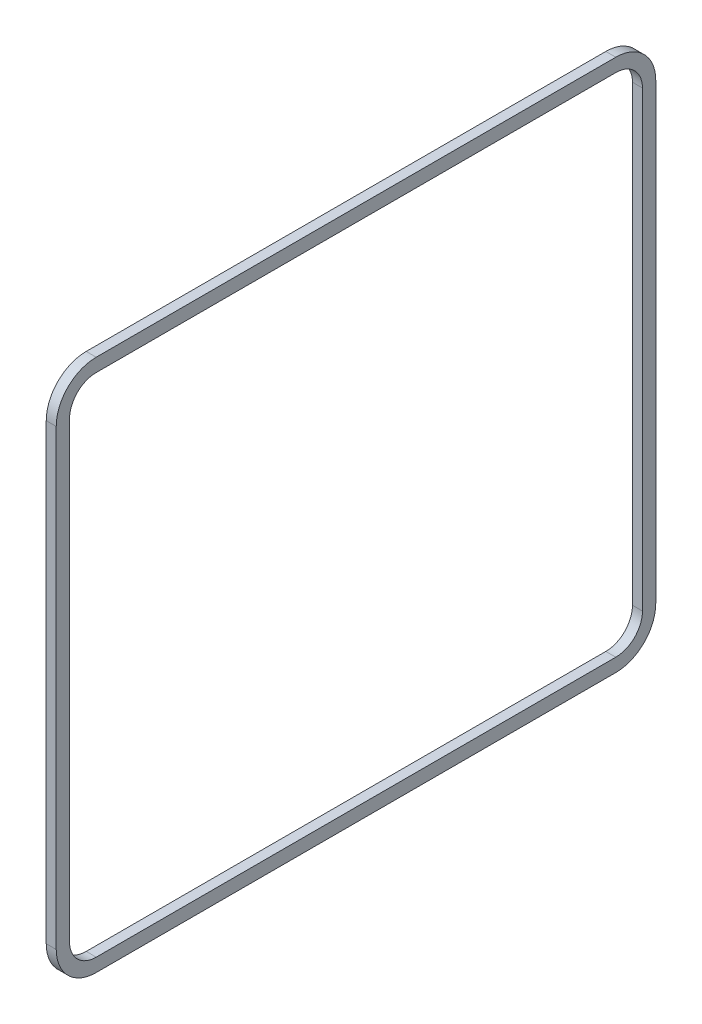
ISO-10303-21;
HEADER;
FILE_DESCRIPTION(('STEP AP214'),'2;1');
FILE_NAME('part.step','',(''),(''),'','','');
FILE_SCHEMA(('AUTOMOTIVE_DESIGN { 1 0 10303 214 1 1 1 1 }'));
ENDSEC;
DATA;
#1=APPLICATION_CONTEXT('core data for automotive mechanical design processes');
#2=APPLICATION_PROTOCOL_DEFINITION('international standard','automotive_design',2000,#1);
#3=PRODUCT_CONTEXT('',#1,'mechanical');
#4=PRODUCT('Part','Part','',(#3));
#5=PRODUCT_RELATED_PRODUCT_CATEGORY('part','',(#4));
#6=PRODUCT_DEFINITION_FORMATION('','',#4);
#7=PRODUCT_DEFINITION_CONTEXT('part definition',#1,'design');
#8=PRODUCT_DEFINITION('design','',#6,#7);
#9=PRODUCT_DEFINITION_SHAPE('','',#8);
#10=(LENGTH_UNIT() NAMED_UNIT(*) SI_UNIT(.MILLI.,.METRE.));
#11=(NAMED_UNIT(*) PLANE_ANGLE_UNIT() SI_UNIT($,.RADIAN.));
#12=(NAMED_UNIT(*) SI_UNIT($,.STERADIAN.) SOLID_ANGLE_UNIT());
#13=UNCERTAINTY_MEASURE_WITH_UNIT(LENGTH_MEASURE(1.E-05),#10,'distance_accuracy_value','');
#14=(GEOMETRIC_REPRESENTATION_CONTEXT(3) GLOBAL_UNCERTAINTY_ASSIGNED_CONTEXT((#13)) GLOBAL_UNIT_ASSIGNED_CONTEXT((#10,
#11,#12)) REPRESENTATION_CONTEXT('',''));
#15=CARTESIAN_POINT('',(0.,0.,0.));
#16=DIRECTION('',(0.,0.,1.));
#17=DIRECTION('',(1.,0.,0.));
#18=AXIS2_PLACEMENT_3D('',#15,#16,#17);
#19=CARTESIAN_POINT('',(1.5,-34.,39.));
#20=DIRECTION('',(1.,0.,0.));
#21=DIRECTION('',(0.,0.,-1.));
#22=AXIS2_PLACEMENT_3D('',#19,#20,#21);
#23=PLANE('',#22);
#24=CARTESIAN_POINT('',(1.5,-34.,39.));
#25=DIRECTION('',(1.,0.,0.));
#26=DIRECTION('',(0.,0.,-1.));
#27=AXIS2_PLACEMENT_3D('',#24,#25,#26);
#28=CIRCLE('',#27,6.);
#29=CARTESIAN_POINT('',(1.5,-34.,45.));
#30=VERTEX_POINT('',#29);
#31=CARTESIAN_POINT('',(1.5,-40.,39.));
#32=VERTEX_POINT('',#31);
#33=EDGE_CURVE('E213',#30,#32,#28,.T.);
#34=ORIENTED_EDGE('',*,*,#33,.T.);
#35=DIRECTION('',(0.,0.,-1.));
#36=VECTOR('',#35,1.);
#37=CARTESIAN_POINT('',(1.5,-40.,-39.));
#38=LINE('',#37,#36);
#39=CARTESIAN_POINT('',(1.5,-40.,-39.));
#40=VERTEX_POINT('',#39);
#41=EDGE_CURVE('E216',#32,#40,#38,.T.);
#42=ORIENTED_EDGE('',*,*,#41,.T.);
#43=CARTESIAN_POINT('',(1.5,-34.,-39.));
#44=DIRECTION('',(1.,0.,0.));
#45=DIRECTION('',(0.,0.,-1.));
#46=AXIS2_PLACEMENT_3D('',#43,#44,#45);
#47=CIRCLE('',#46,6.);
#48=CARTESIAN_POINT('',(1.5,-34.,-45.));
#49=VERTEX_POINT('',#48);
#50=EDGE_CURVE('E219',#40,#49,#47,.T.);
#51=ORIENTED_EDGE('',*,*,#50,.T.);
#52=DIRECTION('',(0.,1.,0.));
#53=VECTOR('',#52,1.);
#54=CARTESIAN_POINT('',(1.5,-34.,-45.));
#55=LINE('',#54,#53);
#56=CARTESIAN_POINT('',(1.5,34.,-45.));
#57=VERTEX_POINT('',#56);
#58=EDGE_CURVE('E221',#49,#57,#55,.T.);
#59=ORIENTED_EDGE('',*,*,#58,.T.);
#60=CARTESIAN_POINT('',(1.5,34.,-39.));
#61=DIRECTION('',(1.,0.,0.));
#62=DIRECTION('',(0.,0.,-1.));
#63=AXIS2_PLACEMENT_3D('',#60,#61,#62);
#64=CIRCLE('',#63,6.);
#65=CARTESIAN_POINT('',(1.5,40.,-39.));
#66=VERTEX_POINT('',#65);
#67=EDGE_CURVE('E223',#57,#66,#64,.T.);
#68=ORIENTED_EDGE('',*,*,#67,.T.);
#69=DIRECTION('',(0.,0.,1.));
#70=VECTOR('',#69,1.);
#71=CARTESIAN_POINT('',(1.5,40.,-39.));
#72=LINE('',#71,#70);
#73=CARTESIAN_POINT('',(1.5,40.,39.));
#74=VERTEX_POINT('',#73);
#75=EDGE_CURVE('E225',#66,#74,#72,.T.);
#76=ORIENTED_EDGE('',*,*,#75,.T.);
#77=CARTESIAN_POINT('',(1.5,34.,39.));
#78=DIRECTION('',(1.,0.,0.));
#79=DIRECTION('',(0.,0.,1.));
#80=AXIS2_PLACEMENT_3D('',#77,#78,#79);
#81=CIRCLE('',#80,5.99999999999999);
#82=CARTESIAN_POINT('',(1.5,34.,45.));
#83=VERTEX_POINT('',#82);
#84=EDGE_CURVE('E227',#74,#83,#81,.T.);
#85=ORIENTED_EDGE('',*,*,#84,.T.);
#86=DIRECTION('',(0.,-1.,0.));
#87=VECTOR('',#86,1.);
#88=CARTESIAN_POINT('',(1.5,-34.,45.));
#89=LINE('',#88,#87);
#90=EDGE_CURVE('E229',#83,#30,#89,.T.);
#91=ORIENTED_EDGE('',*,*,#90,.T.);
#92=EDGE_LOOP('',(#34,#42,#51,#59,#68,#76,#85,#91));
#93=FACE_BOUND('',#92,.T.);
#94=DIRECTION('',(0.,0.,1.));
#95=VECTOR('',#94,1.);
#96=CARTESIAN_POINT('',(1.5,38.,-39.));
#97=LINE('',#96,#95);
#98=CARTESIAN_POINT('',(1.5,38.,-39.));
#99=VERTEX_POINT('',#98);
#100=CARTESIAN_POINT('',(1.5,38.,39.));
#101=VERTEX_POINT('',#100);
#102=EDGE_CURVE('E156',#99,#101,#97,.T.);
#103=ORIENTED_EDGE('',*,*,#102,.F.);
#104=CARTESIAN_POINT('',(1.5,34.,-39.));
#105=DIRECTION('',(1.,0.,0.));
#106=DIRECTION('',(0.,0.,-1.));
#107=AXIS2_PLACEMENT_3D('',#104,#105,#106);
#108=CIRCLE('',#107,4.);
#109=CARTESIAN_POINT('',(1.5,34.,-43.));
#110=VERTEX_POINT('',#109);
#111=EDGE_CURVE('E148',#110,#99,#108,.T.);
#112=ORIENTED_EDGE('',*,*,#111,.F.);
#113=DIRECTION('',(0.,1.,0.));
#114=VECTOR('',#113,1.);
#115=CARTESIAN_POINT('',(1.5,-34.,-43.));
#116=LINE('',#115,#114);
#117=CARTESIAN_POINT('',(1.5,-34.,-43.));
#118=VERTEX_POINT('',#117);
#119=EDGE_CURVE('E181',#118,#110,#116,.T.);
#120=ORIENTED_EDGE('',*,*,#119,.F.);
#121=CARTESIAN_POINT('',(1.5,-34.,-39.));
#122=DIRECTION('',(1.,0.,0.));
#123=DIRECTION('',(0.,0.,-1.));
#124=AXIS2_PLACEMENT_3D('',#121,#122,#123);
#125=CIRCLE('',#124,4.);
#126=CARTESIAN_POINT('',(1.5,-38.,-39.));
#127=VERTEX_POINT('',#126);
#128=EDGE_CURVE('E179',#127,#118,#125,.T.);
#129=ORIENTED_EDGE('',*,*,#128,.F.);
#130=DIRECTION('',(0.,0.,-1.));
#131=VECTOR('',#130,1.);
#132=CARTESIAN_POINT('',(1.5,-38.,-39.));
#133=LINE('',#132,#131);
#134=CARTESIAN_POINT('',(1.5,-38.,39.));
#135=VERTEX_POINT('',#134);
#136=EDGE_CURVE('E177',#135,#127,#133,.T.);
#137=ORIENTED_EDGE('',*,*,#136,.F.);
#138=CARTESIAN_POINT('',(1.5,-34.,39.));
#139=DIRECTION('',(1.,0.,0.));
#140=DIRECTION('',(0.,0.,-1.));
#141=AXIS2_PLACEMENT_3D('',#138,#139,#140);
#142=CIRCLE('',#141,4.);
#143=CARTESIAN_POINT('',(1.5,-34.,43.));
#144=VERTEX_POINT('',#143);
#145=EDGE_CURVE('E175',#144,#135,#142,.T.);
#146=ORIENTED_EDGE('',*,*,#145,.F.);
#147=DIRECTION('',(0.,-1.,0.));
#148=VECTOR('',#147,1.);
#149=CARTESIAN_POINT('',(1.5,-34.,43.));
#150=LINE('',#149,#148);
#151=CARTESIAN_POINT('',(1.5,34.,43.));
#152=VERTEX_POINT('',#151);
#153=EDGE_CURVE('E171',#152,#144,#150,.T.);
#154=ORIENTED_EDGE('',*,*,#153,.F.);
#155=CARTESIAN_POINT('',(1.5,34.,39.));
#156=DIRECTION('',(1.,0.,0.));
#157=DIRECTION('',(0.,0.,1.));
#158=AXIS2_PLACEMENT_3D('',#155,#156,#157);
#159=CIRCLE('',#158,4.);
#160=EDGE_CURVE('E169',#101,#152,#159,.T.);
#161=ORIENTED_EDGE('',*,*,#160,.F.);
#162=EDGE_LOOP('',(#103,#112,#120,#129,#137,#146,#154,#161));
#163=FACE_BOUND('',#162,.T.);
#164=ADVANCED_FACE('F35',(#93,#163),#23,.T.);
#165=CARTESIAN_POINT('',(0.,-34.,39.));
#166=DIRECTION('',(1.,0.,0.));
#167=DIRECTION('',(0.,0.,-1.));
#168=AXIS2_PLACEMENT_3D('',#165,#166,#167);
#169=PLANE('',#168);
#170=CARTESIAN_POINT('',(0.,-34.,39.));
#171=DIRECTION('',(1.,0.,0.));
#172=DIRECTION('',(0.,0.,-1.));
#173=AXIS2_PLACEMENT_3D('',#170,#171,#172);
#174=CIRCLE('',#173,6.);
#175=CARTESIAN_POINT('',(0.,-34.,45.));
#176=VERTEX_POINT('',#175);
#177=CARTESIAN_POINT('',(0.,-40.,39.));
#178=VERTEX_POINT('',#177);
#179=EDGE_CURVE('E164',#176,#178,#174,.T.);
#180=ORIENTED_EDGE('',*,*,#179,.F.);
#181=DIRECTION('',(0.,-1.,0.));
#182=VECTOR('',#181,1.);
#183=CARTESIAN_POINT('',(0.,-34.,45.));
#184=LINE('',#183,#182);
#185=CARTESIAN_POINT('',(0.,34.,45.));
#186=VERTEX_POINT('',#185);
#187=EDGE_CURVE('E217',#186,#176,#184,.T.);
#188=ORIENTED_EDGE('',*,*,#187,.F.);
#189=CARTESIAN_POINT('',(0.,34.,39.));
#190=DIRECTION('',(1.,0.,0.));
#191=DIRECTION('',(0.,0.,1.));
#192=AXIS2_PLACEMENT_3D('',#189,#190,#191);
#193=CIRCLE('',#192,5.99999999999999);
#194=CARTESIAN_POINT('',(0.,40.,39.));
#195=VERTEX_POINT('',#194);
#196=EDGE_CURVE('E244',#195,#186,#193,.T.);
#197=ORIENTED_EDGE('',*,*,#196,.F.);
#198=DIRECTION('',(0.,0.,1.));
#199=VECTOR('',#198,1.);
#200=CARTESIAN_POINT('',(0.,40.,-39.));
#201=LINE('',#200,#199);
#202=CARTESIAN_POINT('',(0.,40.,-39.));
#203=VERTEX_POINT('',#202);
#204=EDGE_CURVE('E242',#203,#195,#201,.T.);
#205=ORIENTED_EDGE('',*,*,#204,.F.);
#206=CARTESIAN_POINT('',(0.,34.,-39.));
#207=DIRECTION('',(1.,0.,0.));
#208=DIRECTION('',(0.,0.,-1.));
#209=AXIS2_PLACEMENT_3D('',#206,#207,#208);
#210=CIRCLE('',#209,6.);
#211=CARTESIAN_POINT('',(0.,34.,-45.));
#212=VERTEX_POINT('',#211);
#213=EDGE_CURVE('E240',#212,#203,#210,.T.);
#214=ORIENTED_EDGE('',*,*,#213,.F.);
#215=DIRECTION('',(0.,1.,0.));
#216=VECTOR('',#215,1.);
#217=CARTESIAN_POINT('',(0.,-34.,-45.));
#218=LINE('',#217,#216);
#219=CARTESIAN_POINT('',(0.,-34.,-45.));
#220=VERTEX_POINT('',#219);
#221=EDGE_CURVE('E238',#220,#212,#218,.T.);
#222=ORIENTED_EDGE('',*,*,#221,.F.);
#223=CARTESIAN_POINT('',(0.,-34.,-39.));
#224=DIRECTION('',(1.,0.,0.));
#225=DIRECTION('',(0.,0.,-1.));
#226=AXIS2_PLACEMENT_3D('',#223,#224,#225);
#227=CIRCLE('',#226,6.);
#228=CARTESIAN_POINT('',(0.,-40.,-39.));
#229=VERTEX_POINT('',#228);
#230=EDGE_CURVE('E236',#229,#220,#227,.T.);
#231=ORIENTED_EDGE('',*,*,#230,.F.);
#232=DIRECTION('',(0.,0.,-1.));
#233=VECTOR('',#232,1.);
#234=CARTESIAN_POINT('',(0.,-40.,-39.));
#235=LINE('',#234,#233);
#236=EDGE_CURVE('E234',#178,#229,#235,.T.);
#237=ORIENTED_EDGE('',*,*,#236,.F.);
#238=EDGE_LOOP('',(#180,#188,#197,#205,#214,#222,#231,#237));
#239=FACE_BOUND('',#238,.T.);
#240=CARTESIAN_POINT('',(0.,34.,-39.));
#241=DIRECTION('',(1.,0.,0.));
#242=DIRECTION('',(0.,0.,-1.));
#243=AXIS2_PLACEMENT_3D('',#240,#241,#242);
#244=CIRCLE('',#243,4.);
#245=CARTESIAN_POINT('',(0.,34.,-43.));
#246=VERTEX_POINT('',#245);
#247=CARTESIAN_POINT('',(0.,38.,-39.));
#248=VERTEX_POINT('',#247);
#249=EDGE_CURVE('E58',#246,#248,#244,.T.);
#250=ORIENTED_EDGE('',*,*,#249,.T.);
#251=DIRECTION('',(0.,0.,1.));
#252=VECTOR('',#251,1.);
#253=CARTESIAN_POINT('',(0.,38.,-39.));
#254=LINE('',#253,#252);
#255=CARTESIAN_POINT('',(0.,38.,39.));
#256=VERTEX_POINT('',#255);
#257=EDGE_CURVE('E163',#248,#256,#254,.T.);
#258=ORIENTED_EDGE('',*,*,#257,.T.);
#259=CARTESIAN_POINT('',(0.,34.,39.));
#260=DIRECTION('',(1.,0.,0.));
#261=DIRECTION('',(0.,0.,1.));
#262=AXIS2_PLACEMENT_3D('',#259,#260,#261);
#263=CIRCLE('',#262,4.);
#264=CARTESIAN_POINT('',(0.,34.,43.));
#265=VERTEX_POINT('',#264);
#266=EDGE_CURVE('E185',#256,#265,#263,.T.);
#267=ORIENTED_EDGE('',*,*,#266,.T.);
#268=DIRECTION('',(0.,-1.,0.));
#269=VECTOR('',#268,1.);
#270=CARTESIAN_POINT('',(0.,-34.,43.));
#271=LINE('',#270,#269);
#272=CARTESIAN_POINT('',(0.,-34.,43.));
#273=VERTEX_POINT('',#272);
#274=EDGE_CURVE('E188',#265,#273,#271,.T.);
#275=ORIENTED_EDGE('',*,*,#274,.T.);
#276=CARTESIAN_POINT('',(0.,-34.,39.));
#277=DIRECTION('',(1.,0.,0.));
#278=DIRECTION('',(0.,0.,-1.));
#279=AXIS2_PLACEMENT_3D('',#276,#277,#278);
#280=CIRCLE('',#279,4.);
#281=CARTESIAN_POINT('',(0.,-38.,39.));
#282=VERTEX_POINT('',#281);
#283=EDGE_CURVE('E191',#273,#282,#280,.T.);
#284=ORIENTED_EDGE('',*,*,#283,.T.);
#285=DIRECTION('',(0.,0.,-1.));
#286=VECTOR('',#285,1.);
#287=CARTESIAN_POINT('',(0.,-38.,-39.));
#288=LINE('',#287,#286);
#289=CARTESIAN_POINT('',(0.,-38.,-39.));
#290=VERTEX_POINT('',#289);
#291=EDGE_CURVE('E194',#282,#290,#288,.T.);
#292=ORIENTED_EDGE('',*,*,#291,.T.);
#293=CARTESIAN_POINT('',(0.,-34.,-39.));
#294=DIRECTION('',(1.,0.,0.));
#295=DIRECTION('',(0.,0.,-1.));
#296=AXIS2_PLACEMENT_3D('',#293,#294,#295);
#297=CIRCLE('',#296,4.);
#298=CARTESIAN_POINT('',(0.,-34.,-43.));
#299=VERTEX_POINT('',#298);
#300=EDGE_CURVE('E197',#290,#299,#297,.T.);
#301=ORIENTED_EDGE('',*,*,#300,.T.);
#302=DIRECTION('',(0.,1.,0.));
#303=VECTOR('',#302,1.);
#304=CARTESIAN_POINT('',(0.,-34.,-43.));
#305=LINE('',#304,#303);
#306=EDGE_CURVE('E157',#299,#246,#305,.T.);
#307=ORIENTED_EDGE('',*,*,#306,.T.);
#308=EDGE_LOOP('',(#250,#258,#267,#275,#284,#292,#301,#307));
#309=FACE_BOUND('',#308,.T.);
#310=ADVANCED_FACE('F274',(#239,#309),#169,.F.);
#311=CARTESIAN_POINT('',(1.5,-34.,39.));
#312=DIRECTION('',(-1.,0.,0.));
#313=DIRECTION('',(0.,0.,1.));
#314=AXIS2_PLACEMENT_3D('',#311,#312,#313);
#315=CYLINDRICAL_SURFACE('',#314,6.);
#316=ORIENTED_EDGE('',*,*,#179,.T.);
#317=DIRECTION('',(-1.,0.,0.));
#318=VECTOR('',#317,1.);
#319=CARTESIAN_POINT('',(1.5,-40.,39.));
#320=LINE('',#319,#318);
#321=EDGE_CURVE('E11',#32,#178,#320,.T.);
#322=ORIENTED_EDGE('',*,*,#321,.F.);
#323=ORIENTED_EDGE('',*,*,#33,.F.);
#324=DIRECTION('',(-1.,0.,0.));
#325=VECTOR('',#324,1.);
#326=CARTESIAN_POINT('',(1.5,-34.,45.));
#327=LINE('',#326,#325);
#328=EDGE_CURVE('E231',#30,#176,#327,.T.);
#329=ORIENTED_EDGE('',*,*,#328,.T.);
#330=EDGE_LOOP('',(#316,#322,#323,#329));
#331=FACE_BOUND('',#330,.T.);
#332=ADVANCED_FACE('F37',(#331),#315,.T.);
#333=CARTESIAN_POINT('',(1.5,-40.,-39.));
#334=DIRECTION('',(0.,1.,0.));
#335=DIRECTION('',(0.,0.,1.));
#336=AXIS2_PLACEMENT_3D('',#333,#334,#335);
#337=PLANE('',#336);
#338=ORIENTED_EDGE('',*,*,#236,.T.);
#339=DIRECTION('',(-1.,0.,0.));
#340=VECTOR('',#339,1.);
#341=CARTESIAN_POINT('',(1.5,-40.,-39.));
#342=LINE('',#341,#340);
#343=EDGE_CURVE('E43',#40,#229,#342,.T.);
#344=ORIENTED_EDGE('',*,*,#343,.F.);
#345=ORIENTED_EDGE('',*,*,#41,.F.);
#346=ORIENTED_EDGE('',*,*,#321,.T.);
#347=EDGE_LOOP('',(#338,#344,#345,#346));
#348=FACE_BOUND('',#347,.T.);
#349=ADVANCED_FACE('F291',(#348),#337,.F.);
#350=CARTESIAN_POINT('',(1.5,-34.,-39.));
#351=DIRECTION('',(-1.,0.,0.));
#352=DIRECTION('',(0.,0.,1.));
#353=AXIS2_PLACEMENT_3D('',#350,#351,#352);
#354=CYLINDRICAL_SURFACE('',#353,6.);
#355=ORIENTED_EDGE('',*,*,#230,.T.);
#356=DIRECTION('',(-1.,0.,0.));
#357=VECTOR('',#356,1.);
#358=CARTESIAN_POINT('',(1.5,-34.,-45.));
#359=LINE('',#358,#357);
#360=EDGE_CURVE('E261',#49,#220,#359,.T.);
#361=ORIENTED_EDGE('',*,*,#360,.F.);
#362=ORIENTED_EDGE('',*,*,#50,.F.);
#363=ORIENTED_EDGE('',*,*,#343,.T.);
#364=EDGE_LOOP('',(#355,#361,#362,#363));
#365=FACE_BOUND('',#364,.T.);
#366=ADVANCED_FACE('F268',(#365),#354,.T.);
#367=CARTESIAN_POINT('',(1.5,-34.,-45.));
#368=DIRECTION('',(0.,0.,1.));
#369=DIRECTION('',(1.,0.,0.));
#370=AXIS2_PLACEMENT_3D('',#367,#368,#369);
#371=PLANE('',#370);
#372=ORIENTED_EDGE('',*,*,#221,.T.);
#373=DIRECTION('',(-1.,0.,0.));
#374=VECTOR('',#373,1.);
#375=CARTESIAN_POINT('',(1.5,34.,-45.));
#376=LINE('',#375,#374);
#377=EDGE_CURVE('E258',#57,#212,#376,.T.);
#378=ORIENTED_EDGE('',*,*,#377,.F.);
#379=ORIENTED_EDGE('',*,*,#58,.F.);
#380=ORIENTED_EDGE('',*,*,#360,.T.);
#381=EDGE_LOOP('',(#372,#378,#379,#380));
#382=FACE_BOUND('',#381,.T.);
#383=ADVANCED_FACE('F280',(#382),#371,.F.);
#384=CARTESIAN_POINT('',(1.5,34.,-39.));
#385=DIRECTION('',(-1.,0.,0.));
#386=DIRECTION('',(0.,0.,1.));
#387=AXIS2_PLACEMENT_3D('',#384,#385,#386);
#388=CYLINDRICAL_SURFACE('',#387,6.);
#389=ORIENTED_EDGE('',*,*,#213,.T.);
#390=DIRECTION('',(-1.,0.,0.));
#391=VECTOR('',#390,1.);
#392=CARTESIAN_POINT('',(1.5,40.,-39.));
#393=LINE('',#392,#391);
#394=EDGE_CURVE('E255',#66,#203,#393,.T.);
#395=ORIENTED_EDGE('',*,*,#394,.F.);
#396=ORIENTED_EDGE('',*,*,#67,.F.);
#397=ORIENTED_EDGE('',*,*,#377,.T.);
#398=EDGE_LOOP('',(#389,#395,#396,#397));
#399=FACE_BOUND('',#398,.T.);
#400=ADVANCED_FACE('F284',(#399),#388,.T.);
#401=CARTESIAN_POINT('',(1.5,40.,-39.));
#402=DIRECTION('',(0.,-1.,0.));
#403=DIRECTION('',(0.,0.,-1.));
#404=AXIS2_PLACEMENT_3D('',#401,#402,#403);
#405=PLANE('',#404);
#406=ORIENTED_EDGE('',*,*,#204,.T.);
#407=DIRECTION('',(-1.,0.,0.));
#408=VECTOR('',#407,1.);
#409=CARTESIAN_POINT('',(1.5,40.,39.));
#410=LINE('',#409,#408);
#411=EDGE_CURVE('E252',#74,#195,#410,.T.);
#412=ORIENTED_EDGE('',*,*,#411,.F.);
#413=ORIENTED_EDGE('',*,*,#75,.F.);
#414=ORIENTED_EDGE('',*,*,#394,.T.);
#415=EDGE_LOOP('',(#406,#412,#413,#414));
#416=FACE_BOUND('',#415,.T.);
#417=ADVANCED_FACE('F304',(#416),#405,.F.);
#418=CARTESIAN_POINT('',(1.5,34.,39.));
#419=DIRECTION('',(-1.,0.,0.));
#420=DIRECTION('',(0.,0.,1.));
#421=AXIS2_PLACEMENT_3D('',#418,#419,#420);
#422=CYLINDRICAL_SURFACE('',#421,5.99999999999999);
#423=ORIENTED_EDGE('',*,*,#196,.T.);
#424=DIRECTION('',(-1.,0.,0.));
#425=VECTOR('',#424,1.);
#426=CARTESIAN_POINT('',(1.5,34.,45.));
#427=LINE('',#426,#425);
#428=EDGE_CURVE('E249',#83,#186,#427,.T.);
#429=ORIENTED_EDGE('',*,*,#428,.F.);
#430=ORIENTED_EDGE('',*,*,#84,.F.);
#431=ORIENTED_EDGE('',*,*,#411,.T.);
#432=EDGE_LOOP('',(#423,#429,#430,#431));
#433=FACE_BOUND('',#432,.T.);
#434=ADVANCED_FACE('F302',(#433),#422,.T.);
#435=CARTESIAN_POINT('',(1.5,-34.,45.));
#436=DIRECTION('',(0.,0.,-1.));
#437=DIRECTION('',(0.,1.,0.));
#438=AXIS2_PLACEMENT_3D('',#435,#436,#437);
#439=PLANE('',#438);
#440=ORIENTED_EDGE('',*,*,#187,.T.);
#441=ORIENTED_EDGE('',*,*,#328,.F.);
#442=ORIENTED_EDGE('',*,*,#90,.F.);
#443=ORIENTED_EDGE('',*,*,#428,.T.);
#444=EDGE_LOOP('',(#440,#441,#442,#443));
#445=FACE_BOUND('',#444,.T.);
#446=ADVANCED_FACE('F297',(#445),#439,.F.);
#447=CARTESIAN_POINT('',(1.5,34.,-39.));
#448=DIRECTION('',(-1.,0.,0.));
#449=DIRECTION('',(0.,0.,1.));
#450=AXIS2_PLACEMENT_3D('',#447,#448,#449);
#451=CYLINDRICAL_SURFACE('',#450,4.);
#452=ORIENTED_EDGE('',*,*,#249,.F.);
#453=DIRECTION('',(-1.,0.,0.));
#454=VECTOR('',#453,1.);
#455=CARTESIAN_POINT('',(1.5,34.,-43.));
#456=LINE('',#455,#454);
#457=EDGE_CURVE('E152',#110,#246,#456,.T.);
#458=ORIENTED_EDGE('',*,*,#457,.F.);
#459=ORIENTED_EDGE('',*,*,#111,.T.);
#460=DIRECTION('',(-1.,0.,0.));
#461=VECTOR('',#460,1.);
#462=CARTESIAN_POINT('',(1.5,38.,-39.));
#463=LINE('',#462,#461);
#464=EDGE_CURVE('E151',#99,#248,#463,.T.);
#465=ORIENTED_EDGE('',*,*,#464,.T.);
#466=EDGE_LOOP('',(#452,#458,#459,#465));
#467=FACE_BOUND('',#466,.T.);
#468=ADVANCED_FACE('F150',(#467),#451,.F.);
#469=CARTESIAN_POINT('',(1.5,38.,-39.));
#470=DIRECTION('',(0.,-1.,0.));
#471=DIRECTION('',(0.,0.,-1.));
#472=AXIS2_PLACEMENT_3D('',#469,#470,#471);
#473=PLANE('',#472);
#474=ORIENTED_EDGE('',*,*,#257,.F.);
#475=ORIENTED_EDGE('',*,*,#464,.F.);
#476=ORIENTED_EDGE('',*,*,#102,.T.);
#477=DIRECTION('',(-1.,0.,0.));
#478=VECTOR('',#477,1.);
#479=CARTESIAN_POINT('',(1.5,38.,39.));
#480=LINE('',#479,#478);
#481=EDGE_CURVE('E165',#101,#256,#480,.T.);
#482=ORIENTED_EDGE('',*,*,#481,.T.);
#483=EDGE_LOOP('',(#474,#475,#476,#482));
#484=FACE_BOUND('',#483,.T.);
#485=ADVANCED_FACE('F160',(#484),#473,.T.);
#486=CARTESIAN_POINT('',(1.5,34.,39.));
#487=DIRECTION('',(-1.,0.,0.));
#488=DIRECTION('',(0.,0.,1.));
#489=AXIS2_PLACEMENT_3D('',#486,#487,#488);
#490=CYLINDRICAL_SURFACE('',#489,4.);
#491=ORIENTED_EDGE('',*,*,#266,.F.);
#492=ORIENTED_EDGE('',*,*,#481,.F.);
#493=ORIENTED_EDGE('',*,*,#160,.T.);
#494=DIRECTION('',(-1.,0.,0.));
#495=VECTOR('',#494,1.);
#496=CARTESIAN_POINT('',(1.5,34.,43.));
#497=LINE('',#496,#495);
#498=EDGE_CURVE('E210',#152,#265,#497,.T.);
#499=ORIENTED_EDGE('',*,*,#498,.T.);
#500=EDGE_LOOP('',(#491,#492,#493,#499));
#501=FACE_BOUND('',#500,.T.);
#502=ADVANCED_FACE('F329',(#501),#490,.F.);
#503=CARTESIAN_POINT('',(1.5,-34.,43.));
#504=DIRECTION('',(0.,0.,-1.));
#505=DIRECTION('',(0.,1.,0.));
#506=AXIS2_PLACEMENT_3D('',#503,#504,#505);
#507=PLANE('',#506);
#508=ORIENTED_EDGE('',*,*,#274,.F.);
#509=ORIENTED_EDGE('',*,*,#498,.F.);
#510=ORIENTED_EDGE('',*,*,#153,.T.);
#511=DIRECTION('',(-1.,0.,0.));
#512=VECTOR('',#511,1.);
#513=CARTESIAN_POINT('',(1.5,-34.,43.));
#514=LINE('',#513,#512);
#515=EDGE_CURVE('E208',#144,#273,#514,.T.);
#516=ORIENTED_EDGE('',*,*,#515,.T.);
#517=EDGE_LOOP('',(#508,#509,#510,#516));
#518=FACE_BOUND('',#517,.T.);
#519=ADVANCED_FACE('F333',(#518),#507,.T.);
#520=CARTESIAN_POINT('',(1.5,-34.,39.));
#521=DIRECTION('',(-1.,0.,0.));
#522=DIRECTION('',(0.,0.,1.));
#523=AXIS2_PLACEMENT_3D('',#520,#521,#522);
#524=CYLINDRICAL_SURFACE('',#523,4.);
#525=ORIENTED_EDGE('',*,*,#283,.F.);
#526=ORIENTED_EDGE('',*,*,#515,.F.);
#527=ORIENTED_EDGE('',*,*,#145,.T.);
#528=DIRECTION('',(-1.,0.,0.));
#529=VECTOR('',#528,1.);
#530=CARTESIAN_POINT('',(1.5,-38.,39.));
#531=LINE('',#530,#529);
#532=EDGE_CURVE('E206',#135,#282,#531,.T.);
#533=ORIENTED_EDGE('',*,*,#532,.T.);
#534=EDGE_LOOP('',(#525,#526,#527,#533));
#535=FACE_BOUND('',#534,.T.);
#536=ADVANCED_FACE('F339',(#535),#524,.F.);
#537=CARTESIAN_POINT('',(1.5,-38.,-39.));
#538=DIRECTION('',(0.,1.,0.));
#539=DIRECTION('',(0.,0.,1.));
#540=AXIS2_PLACEMENT_3D('',#537,#538,#539);
#541=PLANE('',#540);
#542=ORIENTED_EDGE('',*,*,#291,.F.);
#543=ORIENTED_EDGE('',*,*,#532,.F.);
#544=ORIENTED_EDGE('',*,*,#136,.T.);
#545=DIRECTION('',(-1.,0.,0.));
#546=VECTOR('',#545,1.);
#547=CARTESIAN_POINT('',(1.5,-38.,-39.));
#548=LINE('',#547,#546);
#549=EDGE_CURVE('E204',#127,#290,#548,.T.);
#550=ORIENTED_EDGE('',*,*,#549,.T.);
#551=EDGE_LOOP('',(#542,#543,#544,#550));
#552=FACE_BOUND('',#551,.T.);
#553=ADVANCED_FACE('F343',(#552),#541,.T.);
#554=CARTESIAN_POINT('',(1.5,-34.,-39.));
#555=DIRECTION('',(-1.,0.,0.));
#556=DIRECTION('',(0.,0.,1.));
#557=AXIS2_PLACEMENT_3D('',#554,#555,#556);
#558=CYLINDRICAL_SURFACE('',#557,4.);
#559=ORIENTED_EDGE('',*,*,#300,.F.);
#560=ORIENTED_EDGE('',*,*,#549,.F.);
#561=ORIENTED_EDGE('',*,*,#128,.T.);
#562=DIRECTION('',(-1.,0.,0.));
#563=VECTOR('',#562,1.);
#564=CARTESIAN_POINT('',(1.5,-34.,-43.));
#565=LINE('',#564,#563);
#566=EDGE_CURVE('E50',#118,#299,#565,.T.);
#567=ORIENTED_EDGE('',*,*,#566,.T.);
#568=EDGE_LOOP('',(#559,#560,#561,#567));
#569=FACE_BOUND('',#568,.T.);
#570=ADVANCED_FACE('F347',(#569),#558,.F.);
#571=CARTESIAN_POINT('',(1.5,-34.,-43.));
#572=DIRECTION('',(0.,0.,1.));
#573=DIRECTION('',(0.,-1.,0.));
#574=AXIS2_PLACEMENT_3D('',#571,#572,#573);
#575=PLANE('',#574);
#576=ORIENTED_EDGE('',*,*,#306,.F.);
#577=ORIENTED_EDGE('',*,*,#566,.F.);
#578=ORIENTED_EDGE('',*,*,#119,.T.);
#579=ORIENTED_EDGE('',*,*,#457,.T.);
#580=EDGE_LOOP('',(#576,#577,#578,#579));
#581=FACE_BOUND('',#580,.T.);
#582=ADVANCED_FACE('F351',(#581),#575,.T.);
#583=CLOSED_SHELL('',(#164,#310,#332,#349,#366,#383,#400,#417,#434,#446,#468,#485,#502,#519,
#536,#553,#570,#582));
#584=MANIFOLD_SOLID_BREP('B2',#583);
#585=ADVANCED_BREP_SHAPE_REPRESENTATION('',(#18,#584),#14);
#586=SHAPE_DEFINITION_REPRESENTATION(#9,#585);
ENDSEC;
END-ISO-10303-21;
